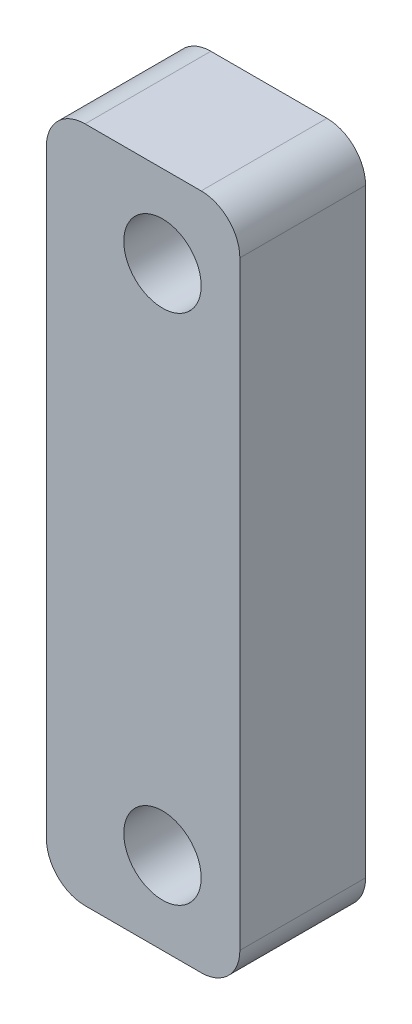
ISO-10303-21;
HEADER;
FILE_DESCRIPTION(('STEP AP214'),'2;1');
FILE_NAME('part.step','',(''),(''),'','','');
FILE_SCHEMA(('AUTOMOTIVE_DESIGN { 1 0 10303 214 1 1 1 1 }'));
ENDSEC;
DATA;
#1=APPLICATION_CONTEXT('core data for automotive mechanical design processes');
#2=APPLICATION_PROTOCOL_DEFINITION('international standard','automotive_design',2000,#1);
#3=PRODUCT_CONTEXT('',#1,'mechanical');
#4=PRODUCT('Part','Part','',(#3));
#5=PRODUCT_RELATED_PRODUCT_CATEGORY('part','',(#4));
#6=PRODUCT_DEFINITION_FORMATION('','',#4);
#7=PRODUCT_DEFINITION_CONTEXT('part definition',#1,'design');
#8=PRODUCT_DEFINITION('design','',#6,#7);
#9=PRODUCT_DEFINITION_SHAPE('','',#8);
#10=(LENGTH_UNIT() NAMED_UNIT(*) SI_UNIT(.MILLI.,.METRE.));
#11=(NAMED_UNIT(*) PLANE_ANGLE_UNIT() SI_UNIT($,.RADIAN.));
#12=(NAMED_UNIT(*) SI_UNIT($,.STERADIAN.) SOLID_ANGLE_UNIT());
#13=UNCERTAINTY_MEASURE_WITH_UNIT(LENGTH_MEASURE(1.E-05),#10,'distance_accuracy_value','');
#14=(GEOMETRIC_REPRESENTATION_CONTEXT(3) GLOBAL_UNCERTAINTY_ASSIGNED_CONTEXT((#13)) GLOBAL_UNIT_ASSIGNED_CONTEXT((#10,
#11,#12)) REPRESENTATION_CONTEXT('',''));
#15=CARTESIAN_POINT('',(0.,0.,0.));
#16=DIRECTION('',(0.,0.,1.));
#17=DIRECTION('',(1.,0.,0.));
#18=AXIS2_PLACEMENT_3D('',#15,#16,#17);
#19=CARTESIAN_POINT('',(2.,2.,4.5));
#20=DIRECTION('',(0.,0.,1.));
#21=DIRECTION('',(1.,0.,0.));
#22=AXIS2_PLACEMENT_3D('',#19,#20,#21);
#23=PLANE('',#22);
#24=CARTESIAN_POINT('',(6.,4.25,4.5));
#25=DIRECTION('',(0.,0.,1.));
#26=DIRECTION('',(1.,0.,0.));
#27=AXIS2_PLACEMENT_3D('',#24,#25,#26);
#28=CIRCLE('',#27,2.);
#29=CARTESIAN_POINT('',(8.,4.25,4.5));
#30=VERTEX_POINT('',#29);
#31=EDGE_CURVE('E143',#30,#30,#28,.T.);
#32=ORIENTED_EDGE('',*,*,#31,.F.);
#33=EDGE_LOOP('',(#32));
#34=FACE_BOUND('',#33,.T.);
#35=CARTESIAN_POINT('',(2.,2.,4.5));
#36=DIRECTION('',(0.,0.,1.));
#37=DIRECTION('',(1.,0.,0.));
#38=AXIS2_PLACEMENT_3D('',#35,#36,#37);
#39=CIRCLE('',#38,2.);
#40=CARTESIAN_POINT('',(0.,2.00000000000001,4.5));
#41=VERTEX_POINT('',#40);
#42=CARTESIAN_POINT('',(2.00000000000001,0.,4.5));
#43=VERTEX_POINT('',#42);
#44=EDGE_CURVE('E146',#41,#43,#39,.T.);
#45=ORIENTED_EDGE('',*,*,#44,.T.);
#46=DIRECTION('',(1.,0.,0.));
#47=VECTOR('',#46,1.);
#48=CARTESIAN_POINT('',(2.00000000000001,0.,4.5));
#49=LINE('',#48,#47);
#50=CARTESIAN_POINT('',(7.99999999999999,0.,4.5));
#51=VERTEX_POINT('',#50);
#52=EDGE_CURVE('E104',#43,#51,#49,.T.);
#53=ORIENTED_EDGE('',*,*,#52,.T.);
#54=CARTESIAN_POINT('',(8.,2.,4.5));
#55=DIRECTION('',(0.,0.,1.));
#56=DIRECTION('',(-1.,0.,0.));
#57=AXIS2_PLACEMENT_3D('',#54,#55,#56);
#58=CIRCLE('',#57,2.);
#59=CARTESIAN_POINT('',(10.,2.00000000000001,4.5));
#60=VERTEX_POINT('',#59);
#61=EDGE_CURVE('E149',#51,#60,#58,.T.);
#62=ORIENTED_EDGE('',*,*,#61,.T.);
#63=DIRECTION('',(0.,1.,0.));
#64=VECTOR('',#63,1.);
#65=CARTESIAN_POINT('',(10.,33.,4.5));
#66=LINE('',#65,#64);
#67=CARTESIAN_POINT('',(10.,33.,4.5));
#68=VERTEX_POINT('',#67);
#69=EDGE_CURVE('E151',#60,#68,#66,.T.);
#70=ORIENTED_EDGE('',*,*,#69,.T.);
#71=CARTESIAN_POINT('',(8.,33.,4.5));
#72=DIRECTION('',(0.,0.,1.));
#73=DIRECTION('',(-1.,0.,0.));
#74=AXIS2_PLACEMENT_3D('',#71,#72,#73);
#75=CIRCLE('',#74,2.);
#76=CARTESIAN_POINT('',(7.99999999999999,35.,4.5));
#77=VERTEX_POINT('',#76);
#78=EDGE_CURVE('E153',#68,#77,#75,.T.);
#79=ORIENTED_EDGE('',*,*,#78,.T.);
#80=DIRECTION('',(-1.,0.,0.));
#81=VECTOR('',#80,1.);
#82=CARTESIAN_POINT('',(2.00000000000001,35.,4.5));
#83=LINE('',#82,#81);
#84=CARTESIAN_POINT('',(2.00000000000001,35.,4.5));
#85=VERTEX_POINT('',#84);
#86=EDGE_CURVE('E155',#77,#85,#83,.T.);
#87=ORIENTED_EDGE('',*,*,#86,.T.);
#88=CARTESIAN_POINT('',(2.,33.,4.5));
#89=DIRECTION('',(0.,0.,1.));
#90=DIRECTION('',(-1.,0.,0.));
#91=AXIS2_PLACEMENT_3D('',#88,#89,#90);
#92=CIRCLE('',#91,2.);
#93=CARTESIAN_POINT('',(0.,33.,4.5));
#94=VERTEX_POINT('',#93);
#95=EDGE_CURVE('E55',#85,#94,#92,.T.);
#96=ORIENTED_EDGE('',*,*,#95,.T.);
#97=DIRECTION('',(0.,-1.,0.));
#98=VECTOR('',#97,1.);
#99=CARTESIAN_POINT('',(0.,2.00000000000001,4.5));
#100=LINE('',#99,#98);
#101=EDGE_CURVE('E50',#94,#41,#100,.T.);
#102=ORIENTED_EDGE('',*,*,#101,.T.);
#103=EDGE_LOOP('',(#45,#53,#62,#70,#79,#87,#96,#102));
#104=FACE_BOUND('',#103,.T.);
#105=CARTESIAN_POINT('',(6.,30.75,4.5));
#106=DIRECTION('',(0.,0.,1.));
#107=DIRECTION('',(1.,0.,0.));
#108=AXIS2_PLACEMENT_3D('',#105,#106,#107);
#109=CIRCLE('',#108,2.);
#110=CARTESIAN_POINT('',(8.,30.75,4.5));
#111=VERTEX_POINT('',#110);
#112=EDGE_CURVE('E140',#111,#111,#109,.T.);
#113=ORIENTED_EDGE('',*,*,#112,.F.);
#114=EDGE_LOOP('',(#113));
#115=FACE_BOUND('',#114,.T.);
#116=ADVANCED_FACE('F35',(#34,#104,#115),#23,.T.);
#117=CARTESIAN_POINT('',(2.,2.,4.5));
#118=DIRECTION('',(0.,0.,-1.));
#119=DIRECTION('',(-1.,0.,0.));
#120=AXIS2_PLACEMENT_3D('',#117,#118,#119);
#121=CYLINDRICAL_SURFACE('',#120,2.);
#122=DIRECTION('',(0.,0.,-1.));
#123=VECTOR('',#122,1.);
#124=CARTESIAN_POINT('',(0.,2.00000000000001,4.5));
#125=LINE('',#124,#123);
#126=CARTESIAN_POINT('',(0.,2.,-2.));
#127=VERTEX_POINT('',#126);
#128=EDGE_CURVE('E109',#41,#127,#125,.T.);
#129=ORIENTED_EDGE('',*,*,#128,.T.);
#130=CARTESIAN_POINT('',(2.,2.,-2.));
#131=DIRECTION('',(0.,0.,-1.));
#132=DIRECTION('',(-1.,0.,0.));
#133=AXIS2_PLACEMENT_3D('',#130,#131,#132);
#134=CIRCLE('',#133,2.);
#135=CARTESIAN_POINT('',(2.00000000000001,0.,-2.));
#136=VERTEX_POINT('',#135);
#137=EDGE_CURVE('E108',#136,#127,#134,.T.);
#138=ORIENTED_EDGE('',*,*,#137,.F.);
#139=DIRECTION('',(0.,0.,-1.));
#140=VECTOR('',#139,1.);
#141=CARTESIAN_POINT('',(2.00000000000001,0.,4.5));
#142=LINE('',#141,#140);
#143=EDGE_CURVE('E11',#43,#136,#142,.T.);
#144=ORIENTED_EDGE('',*,*,#143,.F.);
#145=ORIENTED_EDGE('',*,*,#44,.F.);
#146=EDGE_LOOP('',(#129,#138,#144,#145));
#147=FACE_BOUND('',#146,.T.);
#148=ADVANCED_FACE('F37',(#147),#121,.T.);
#149=CARTESIAN_POINT('',(2.00000000000001,0.,4.5));
#150=DIRECTION('',(0.,1.,0.));
#151=DIRECTION('',(0.,0.,1.));
#152=AXIS2_PLACEMENT_3D('',#149,#150,#151);
#153=PLANE('',#152);
#154=ORIENTED_EDGE('',*,*,#143,.T.);
#155=DIRECTION('',(-1.,0.,0.));
#156=VECTOR('',#155,1.);
#157=CARTESIAN_POINT('',(7.99999999999999,0.,-2.));
#158=LINE('',#157,#156);
#159=CARTESIAN_POINT('',(7.99999999999999,0.,-2.));
#160=VERTEX_POINT('',#159);
#161=EDGE_CURVE('E103',#160,#136,#158,.T.);
#162=ORIENTED_EDGE('',*,*,#161,.F.);
#163=DIRECTION('',(0.,0.,-1.));
#164=VECTOR('',#163,1.);
#165=CARTESIAN_POINT('',(7.99999999999999,0.,4.5));
#166=LINE('',#165,#164);
#167=EDGE_CURVE('E43',#51,#160,#166,.T.);
#168=ORIENTED_EDGE('',*,*,#167,.F.);
#169=ORIENTED_EDGE('',*,*,#52,.F.);
#170=EDGE_LOOP('',(#154,#162,#168,#169));
#171=FACE_BOUND('',#170,.T.);
#172=ADVANCED_FACE('F100',(#171),#153,.F.);
#173=CARTESIAN_POINT('',(8.,2.,4.5));
#174=DIRECTION('',(0.,0.,-1.));
#175=DIRECTION('',(-1.,0.,0.));
#176=AXIS2_PLACEMENT_3D('',#173,#174,#175);
#177=CYLINDRICAL_SURFACE('',#176,2.);
#178=ORIENTED_EDGE('',*,*,#167,.T.);
#179=CARTESIAN_POINT('',(8.,2.,-2.));
#180=DIRECTION('',(0.,0.,-1.));
#181=DIRECTION('',(-1.,0.,0.));
#182=AXIS2_PLACEMENT_3D('',#179,#180,#181);
#183=CIRCLE('',#182,2.);
#184=CARTESIAN_POINT('',(10.,2.00000000000001,-2.));
#185=VERTEX_POINT('',#184);
#186=EDGE_CURVE('E119',#185,#160,#183,.T.);
#187=ORIENTED_EDGE('',*,*,#186,.F.);
#188=DIRECTION('',(0.,0.,-1.));
#189=VECTOR('',#188,1.);
#190=CARTESIAN_POINT('',(10.,2.00000000000001,4.5));
#191=LINE('',#190,#189);
#192=EDGE_CURVE('E168',#60,#185,#191,.T.);
#193=ORIENTED_EDGE('',*,*,#192,.F.);
#194=ORIENTED_EDGE('',*,*,#61,.F.);
#195=EDGE_LOOP('',(#178,#187,#193,#194));
#196=FACE_BOUND('',#195,.T.);
#197=ADVANCED_FACE('F171',(#196),#177,.T.);
#198=CARTESIAN_POINT('',(10.,33.,4.5));
#199=DIRECTION('',(-1.,0.,0.));
#200=DIRECTION('',(0.,0.,1.));
#201=AXIS2_PLACEMENT_3D('',#198,#199,#200);
#202=PLANE('',#201);
#203=ORIENTED_EDGE('',*,*,#192,.T.);
#204=DIRECTION('',(0.,-1.,0.));
#205=VECTOR('',#204,1.);
#206=CARTESIAN_POINT('',(10.,33.,-2.));
#207=LINE('',#206,#205);
#208=CARTESIAN_POINT('',(10.,33.,-2.));
#209=VERTEX_POINT('',#208);
#210=EDGE_CURVE('E137',#209,#185,#207,.T.);
#211=ORIENTED_EDGE('',*,*,#210,.F.);
#212=DIRECTION('',(0.,0.,-1.));
#213=VECTOR('',#212,1.);
#214=CARTESIAN_POINT('',(10.,33.,4.5));
#215=LINE('',#214,#213);
#216=EDGE_CURVE('E166',#68,#209,#215,.T.);
#217=ORIENTED_EDGE('',*,*,#216,.F.);
#218=ORIENTED_EDGE('',*,*,#69,.F.);
#219=EDGE_LOOP('',(#203,#211,#217,#218));
#220=FACE_BOUND('',#219,.T.);
#221=ADVANCED_FACE('F180',(#220),#202,.F.);
#222=CARTESIAN_POINT('',(8.,33.,4.5));
#223=DIRECTION('',(0.,0.,-1.));
#224=DIRECTION('',(-1.,0.,0.));
#225=AXIS2_PLACEMENT_3D('',#222,#223,#224);
#226=CYLINDRICAL_SURFACE('',#225,2.);
#227=ORIENTED_EDGE('',*,*,#216,.T.);
#228=CARTESIAN_POINT('',(8.,33.,-2.));
#229=DIRECTION('',(0.,0.,-1.));
#230=DIRECTION('',(-1.,0.,0.));
#231=AXIS2_PLACEMENT_3D('',#228,#229,#230);
#232=CIRCLE('',#231,2.);
#233=CARTESIAN_POINT('',(7.99999999999999,35.,-2.));
#234=VERTEX_POINT('',#233);
#235=EDGE_CURVE('E134',#234,#209,#232,.T.);
#236=ORIENTED_EDGE('',*,*,#235,.F.);
#237=DIRECTION('',(0.,0.,-1.));
#238=VECTOR('',#237,1.);
#239=CARTESIAN_POINT('',(7.99999999999999,35.,4.5));
#240=LINE('',#239,#238);
#241=EDGE_CURVE('E164',#77,#234,#240,.T.);
#242=ORIENTED_EDGE('',*,*,#241,.F.);
#243=ORIENTED_EDGE('',*,*,#78,.F.);
#244=EDGE_LOOP('',(#227,#236,#242,#243));
#245=FACE_BOUND('',#244,.T.);
#246=ADVANCED_FACE('F183',(#245),#226,.T.);
#247=CARTESIAN_POINT('',(2.00000000000001,35.,4.5));
#248=DIRECTION('',(0.,-1.,0.));
#249=DIRECTION('',(0.,0.,-1.));
#250=AXIS2_PLACEMENT_3D('',#247,#248,#249);
#251=PLANE('',#250);
#252=ORIENTED_EDGE('',*,*,#241,.T.);
#253=DIRECTION('',(1.,0.,0.));
#254=VECTOR('',#253,1.);
#255=CARTESIAN_POINT('',(2.00000000000001,35.,-2.));
#256=LINE('',#255,#254);
#257=CARTESIAN_POINT('',(2.00000000000001,35.,-2.));
#258=VERTEX_POINT('',#257);
#259=EDGE_CURVE('E131',#258,#234,#256,.T.);
#260=ORIENTED_EDGE('',*,*,#259,.F.);
#261=DIRECTION('',(0.,0.,-1.));
#262=VECTOR('',#261,1.);
#263=CARTESIAN_POINT('',(2.00000000000001,35.,4.5));
#264=LINE('',#263,#262);
#265=EDGE_CURVE('E162',#85,#258,#264,.T.);
#266=ORIENTED_EDGE('',*,*,#265,.F.);
#267=ORIENTED_EDGE('',*,*,#86,.F.);
#268=EDGE_LOOP('',(#252,#260,#266,#267));
#269=FACE_BOUND('',#268,.T.);
#270=ADVANCED_FACE('F188',(#269),#251,.F.);
#271=CARTESIAN_POINT('',(2.,33.,4.5));
#272=DIRECTION('',(0.,0.,-1.));
#273=DIRECTION('',(-1.,0.,0.));
#274=AXIS2_PLACEMENT_3D('',#271,#272,#273);
#275=CYLINDRICAL_SURFACE('',#274,2.);
#276=ORIENTED_EDGE('',*,*,#265,.T.);
#277=CARTESIAN_POINT('',(2.,33.,-2.));
#278=DIRECTION('',(0.,0.,-1.));
#279=DIRECTION('',(-1.,0.,0.));
#280=AXIS2_PLACEMENT_3D('',#277,#278,#279);
#281=CIRCLE('',#280,2.);
#282=CARTESIAN_POINT('',(0.,33.,-2.));
#283=VERTEX_POINT('',#282);
#284=EDGE_CURVE('E128',#283,#258,#281,.T.);
#285=ORIENTED_EDGE('',*,*,#284,.F.);
#286=DIRECTION('',(0.,0.,-1.));
#287=VECTOR('',#286,1.);
#288=CARTESIAN_POINT('',(0.,33.,4.5));
#289=LINE('',#288,#287);
#290=EDGE_CURVE('E160',#94,#283,#289,.T.);
#291=ORIENTED_EDGE('',*,*,#290,.F.);
#292=ORIENTED_EDGE('',*,*,#95,.F.);
#293=EDGE_LOOP('',(#276,#285,#291,#292));
#294=FACE_BOUND('',#293,.T.);
#295=ADVANCED_FACE('F191',(#294),#275,.T.);
#296=CARTESIAN_POINT('',(0.,2.00000000000001,4.5));
#297=DIRECTION('',(1.,0.,0.));
#298=DIRECTION('',(0.,0.,-1.));
#299=AXIS2_PLACEMENT_3D('',#296,#297,#298);
#300=PLANE('',#299);
#301=ORIENTED_EDGE('',*,*,#290,.T.);
#302=DIRECTION('',(0.,1.,0.));
#303=VECTOR('',#302,1.);
#304=CARTESIAN_POINT('',(0.,2.,-2.));
#305=LINE('',#304,#303);
#306=EDGE_CURVE('E113',#127,#283,#305,.T.);
#307=ORIENTED_EDGE('',*,*,#306,.F.);
#308=ORIENTED_EDGE('',*,*,#128,.F.);
#309=ORIENTED_EDGE('',*,*,#101,.F.);
#310=EDGE_LOOP('',(#301,#307,#308,#309));
#311=FACE_BOUND('',#310,.T.);
#312=ADVANCED_FACE('F193',(#311),#300,.F.);
#313=CARTESIAN_POINT('',(6.,4.25,4.5));
#314=DIRECTION('',(0.,0.,-1.));
#315=DIRECTION('',(-1.,0.,0.));
#316=AXIS2_PLACEMENT_3D('',#313,#314,#315);
#317=CYLINDRICAL_SURFACE('',#316,2.);
#318=ORIENTED_EDGE('',*,*,#31,.T.);
#319=EDGE_LOOP('',(#318));
#320=FACE_BOUND('',#319,.T.);
#321=CARTESIAN_POINT('',(6.,4.25,-2.));
#322=DIRECTION('',(0.,0.,1.));
#323=DIRECTION('',(1.,0.,0.));
#324=AXIS2_PLACEMENT_3D('',#321,#322,#323);
#325=CIRCLE('',#324,2.);
#326=CARTESIAN_POINT('',(8.,4.25,-2.));
#327=VERTEX_POINT('',#326);
#328=EDGE_CURVE('E120',#327,#327,#325,.T.);
#329=ORIENTED_EDGE('',*,*,#328,.F.);
#330=EDGE_LOOP('',(#329));
#331=FACE_BOUND('',#330,.T.);
#332=ADVANCED_FACE('F195',(#320,#331),#317,.F.);
#333=CARTESIAN_POINT('',(6.,30.75,4.5));
#334=DIRECTION('',(0.,0.,-1.));
#335=DIRECTION('',(-1.,0.,0.));
#336=AXIS2_PLACEMENT_3D('',#333,#334,#335);
#337=CYLINDRICAL_SURFACE('',#336,2.);
#338=ORIENTED_EDGE('',*,*,#112,.T.);
#339=EDGE_LOOP('',(#338));
#340=FACE_BOUND('',#339,.T.);
#341=CARTESIAN_POINT('',(6.,30.75,-2.));
#342=DIRECTION('',(0.,0.,1.));
#343=DIRECTION('',(1.,0.,0.));
#344=AXIS2_PLACEMENT_3D('',#341,#342,#343);
#345=CIRCLE('',#344,2.);
#346=CARTESIAN_POINT('',(8.,30.75,-2.));
#347=VERTEX_POINT('',#346);
#348=EDGE_CURVE('E123',#347,#347,#345,.T.);
#349=ORIENTED_EDGE('',*,*,#348,.F.);
#350=EDGE_LOOP('',(#349));
#351=FACE_BOUND('',#350,.T.);
#352=ADVANCED_FACE('F201',(#340,#351),#337,.F.);
#353=CARTESIAN_POINT('',(2.,2.,-2.));
#354=DIRECTION('',(0.,0.,-1.));
#355=DIRECTION('',(-1.,0.,0.));
#356=AXIS2_PLACEMENT_3D('',#353,#354,#355);
#357=PLANE('',#356);
#358=ORIENTED_EDGE('',*,*,#328,.T.);
#359=EDGE_LOOP('',(#358));
#360=FACE_BOUND('',#359,.T.);
#361=ORIENTED_EDGE('',*,*,#348,.T.);
#362=EDGE_LOOP('',(#361));
#363=FACE_BOUND('',#362,.T.);
#364=ORIENTED_EDGE('',*,*,#161,.T.);
#365=ORIENTED_EDGE('',*,*,#137,.T.);
#366=ORIENTED_EDGE('',*,*,#306,.T.);
#367=ORIENTED_EDGE('',*,*,#284,.T.);
#368=ORIENTED_EDGE('',*,*,#259,.T.);
#369=ORIENTED_EDGE('',*,*,#235,.T.);
#370=ORIENTED_EDGE('',*,*,#210,.T.);
#371=ORIENTED_EDGE('',*,*,#186,.T.);
#372=EDGE_LOOP('',(#364,#365,#366,#367,#368,#369,#370,#371));
#373=FACE_BOUND('',#372,.T.);
#374=ADVANCED_FACE('F116',(#360,#363,#373),#357,.T.);
#375=CLOSED_SHELL('',(#116,#148,#172,#197,#221,#246,#270,#295,#312,#332,#352,#374));
#376=MANIFOLD_SOLID_BREP('B2',#375);
#377=ADVANCED_BREP_SHAPE_REPRESENTATION('',(#18,#376),#14);
#378=SHAPE_DEFINITION_REPRESENTATION(#9,#377);
ENDSEC;
END-ISO-10303-21;
